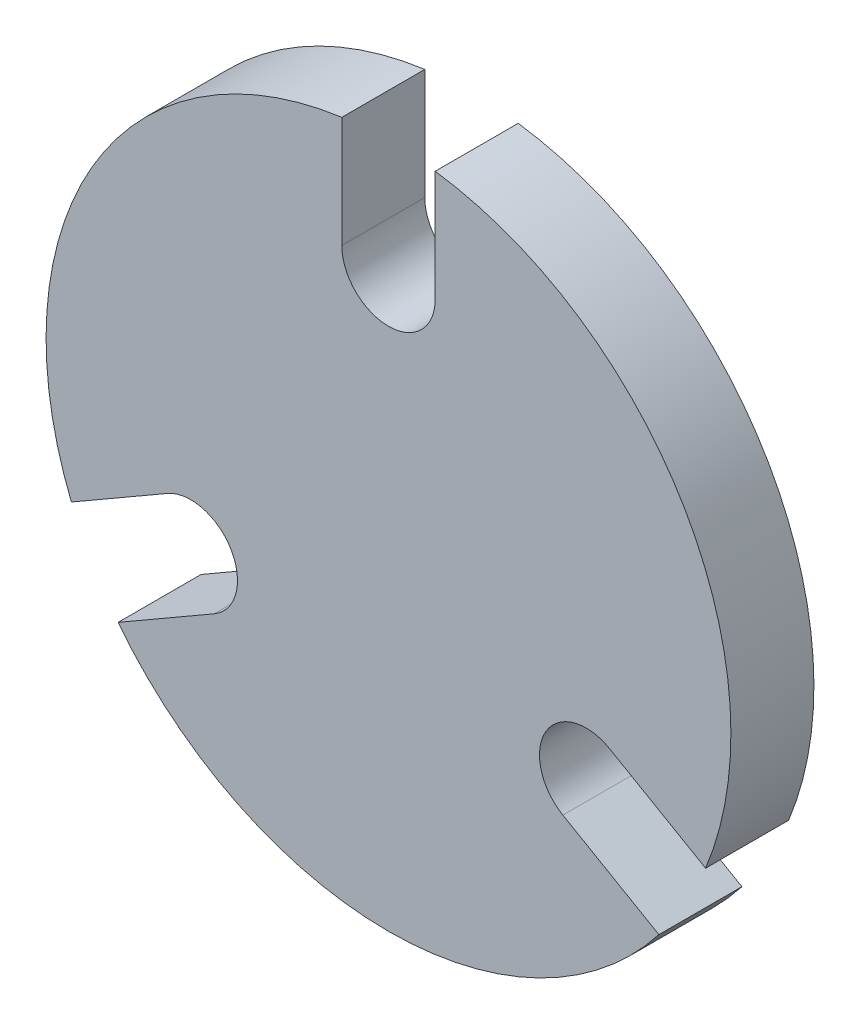
ISO-10303-21;
HEADER;
FILE_DESCRIPTION(('STEP AP214'),'2;1');
FILE_NAME('part.step','',(''),(''),'','','');
FILE_SCHEMA(('AUTOMOTIVE_DESIGN { 1 0 10303 214 1 1 1 1 }'));
ENDSEC;
DATA;
#1=APPLICATION_CONTEXT('core data for automotive mechanical design processes');
#2=APPLICATION_PROTOCOL_DEFINITION('international standard','automotive_design',2000,#1);
#3=PRODUCT_CONTEXT('',#1,'mechanical');
#4=PRODUCT('Part','Part','',(#3));
#5=PRODUCT_RELATED_PRODUCT_CATEGORY('part','',(#4));
#6=PRODUCT_DEFINITION_FORMATION('','',#4);
#7=PRODUCT_DEFINITION_CONTEXT('part definition',#1,'design');
#8=PRODUCT_DEFINITION('design','',#6,#7);
#9=PRODUCT_DEFINITION_SHAPE('','',#8);
#10=(LENGTH_UNIT() NAMED_UNIT(*) SI_UNIT(.MILLI.,.METRE.));
#11=(NAMED_UNIT(*) PLANE_ANGLE_UNIT() SI_UNIT($,.RADIAN.));
#12=(NAMED_UNIT(*) SI_UNIT($,.STERADIAN.) SOLID_ANGLE_UNIT());
#13=UNCERTAINTY_MEASURE_WITH_UNIT(LENGTH_MEASURE(1.E-05),#10,'distance_accuracy_value','');
#14=(GEOMETRIC_REPRESENTATION_CONTEXT(3) GLOBAL_UNCERTAINTY_ASSIGNED_CONTEXT((#13)) GLOBAL_UNIT_ASSIGNED_CONTEXT((#10,
#11,#12)) REPRESENTATION_CONTEXT('',''));
#15=CARTESIAN_POINT('',(0.,0.,0.));
#16=DIRECTION('',(0.,0.,1.));
#17=DIRECTION('',(1.,0.,0.));
#18=AXIS2_PLACEMENT_3D('',#15,#16,#17);
#19=CARTESIAN_POINT('',(0.,2.2,0.8));
#20=DIRECTION('',(0.,0.,-1.));
#21=DIRECTION('',(-1.,0.,0.));
#22=AXIS2_PLACEMENT_3D('',#19,#20,#21);
#23=CYLINDRICAL_SURFACE('',#22,0.45);
#24=CARTESIAN_POINT('',(0.,2.2,0.));
#25=DIRECTION('',(0.,0.,-1.));
#26=DIRECTION('',(1.,0.,0.));
#27=AXIS2_PLACEMENT_3D('',#24,#25,#26);
#28=CIRCLE('',#27,0.45);
#29=CARTESIAN_POINT('',(0.45,2.2,0.));
#30=VERTEX_POINT('',#29);
#31=CARTESIAN_POINT('',(-0.45,2.2,0.));
#32=VERTEX_POINT('',#31);
#33=EDGE_CURVE('E164',#30,#32,#28,.T.);
#34=ORIENTED_EDGE('',*,*,#33,.T.);
#35=DIRECTION('',(0.,0.,-1.));
#36=VECTOR('',#35,1.);
#37=CARTESIAN_POINT('',(-0.45,2.2,0.8));
#38=LINE('',#37,#36);
#39=CARTESIAN_POINT('',(-0.45,2.2,0.8));
#40=VERTEX_POINT('',#39);
#41=EDGE_CURVE('E11',#40,#32,#38,.T.);
#42=ORIENTED_EDGE('',*,*,#41,.F.);
#43=CARTESIAN_POINT('',(0.,2.2,0.8));
#44=DIRECTION('',(0.,0.,-1.));
#45=DIRECTION('',(1.,0.,0.));
#46=AXIS2_PLACEMENT_3D('',#43,#44,#45);
#47=CIRCLE('',#46,0.45);
#48=CARTESIAN_POINT('',(0.45,2.2,0.8));
#49=VERTEX_POINT('',#48);
#50=EDGE_CURVE('E198',#49,#40,#47,.T.);
#51=ORIENTED_EDGE('',*,*,#50,.F.);
#52=DIRECTION('',(0.,0.,-1.));
#53=VECTOR('',#52,1.);
#54=CARTESIAN_POINT('',(0.45,2.2,0.8));
#55=LINE('',#54,#53);
#56=EDGE_CURVE('E160',#49,#30,#55,.T.);
#57=ORIENTED_EDGE('',*,*,#56,.T.);
#58=EDGE_LOOP('',(#34,#42,#51,#57));
#59=FACE_BOUND('',#58,.T.);
#60=ADVANCED_FACE('F39',(#59),#23,.F.);
#61=CARTESIAN_POINT('',(-0.45,2.2,0.8));
#62=DIRECTION('',(-1.,0.,0.));
#63=DIRECTION('',(0.,0.,1.));
#64=AXIS2_PLACEMENT_3D('',#61,#62,#63);
#65=PLANE('',#64);
#66=DIRECTION('',(0.,1.,0.));
#67=VECTOR('',#66,1.);
#68=CARTESIAN_POINT('',(-0.45,2.2,0.));
#69=LINE('',#68,#67);
#70=CARTESIAN_POINT('',(-0.45,3.26917420765551,0.));
#71=VERTEX_POINT('',#70);
#72=EDGE_CURVE('E168',#32,#71,#69,.T.);
#73=ORIENTED_EDGE('',*,*,#72,.T.);
#74=DIRECTION('',(0.,0.,-1.));
#75=VECTOR('',#74,1.);
#76=CARTESIAN_POINT('',(-0.45,3.26917420765551,0.8));
#77=LINE('',#76,#75);
#78=CARTESIAN_POINT('',(-0.45,3.26917420765551,0.8));
#79=VERTEX_POINT('',#78);
#80=EDGE_CURVE('E48',#79,#71,#77,.T.);
#81=ORIENTED_EDGE('',*,*,#80,.F.);
#82=DIRECTION('',(0.,1.,0.));
#83=VECTOR('',#82,1.);
#84=CARTESIAN_POINT('',(-0.45,2.2,0.8));
#85=LINE('',#84,#83);
#86=EDGE_CURVE('E111',#40,#79,#85,.T.);
#87=ORIENTED_EDGE('',*,*,#86,.F.);
#88=ORIENTED_EDGE('',*,*,#41,.T.);
#89=EDGE_LOOP('',(#73,#81,#87,#88));
#90=FACE_BOUND('',#89,.T.);
#91=ADVANCED_FACE('F292',(#90),#65,.F.);
#92=CARTESIAN_POINT('',(0.,0.,0.8));
#93=DIRECTION('',(0.,0.,-1.));
#94=DIRECTION('',(-1.,0.,0.));
#95=AXIS2_PLACEMENT_3D('',#92,#93,#94);
#96=CYLINDRICAL_SURFACE('',#95,3.3);
#97=CARTESIAN_POINT('',(0.,0.,0.));
#98=DIRECTION('',(0.,0.,1.));
#99=DIRECTION('',(1.,0.,0.));
#100=AXIS2_PLACEMENT_3D('',#97,#98,#99);
#101=CIRCLE('',#100,3.3);
#102=CARTESIAN_POINT('',(-3.05618791322653,-1.24487567212476,0.));
#103=VERTEX_POINT('',#102);
#104=EDGE_CURVE('E171',#71,#103,#101,.T.);
#105=ORIENTED_EDGE('',*,*,#104,.T.);
#106=DIRECTION('',(0.,0.,-1.));
#107=VECTOR('',#106,1.);
#108=CARTESIAN_POINT('',(-3.05618791322653,-1.24487567212476,0.8));
#109=LINE('',#108,#107);
#110=CARTESIAN_POINT('',(-3.05618791322653,-1.24487567212476,0.8));
#111=VERTEX_POINT('',#110);
#112=EDGE_CURVE('E225',#111,#103,#109,.T.);
#113=ORIENTED_EDGE('',*,*,#112,.F.);
#114=CARTESIAN_POINT('',(0.,0.,0.8));
#115=DIRECTION('',(0.,0.,1.));
#116=DIRECTION('',(1.,0.,0.));
#117=AXIS2_PLACEMENT_3D('',#114,#115,#116);
#118=CIRCLE('',#117,3.3);
#119=EDGE_CURVE('E235',#79,#111,#118,.T.);
#120=ORIENTED_EDGE('',*,*,#119,.F.);
#121=ORIENTED_EDGE('',*,*,#80,.T.);
#122=EDGE_LOOP('',(#105,#113,#120,#121));
#123=FACE_BOUND('',#122,.T.);
#124=ADVANCED_FACE('F233',(#123),#96,.T.);
#125=CARTESIAN_POINT('',(-2.13025588832576,-0.710288568297004,0.8));
#126=DIRECTION('',(-0.5,0.866025403784438,0.));
#127=DIRECTION('',(-0.866025403784439,-0.5,0.));
#128=AXIS2_PLACEMENT_3D('',#125,#126,#127);
#129=PLANE('',#128);
#130=DIRECTION('',(0.866025403784438,0.5,0.));
#131=VECTOR('',#130,1.);
#132=CARTESIAN_POINT('',(-2.13025588832576,-0.710288568297004,0.));
#133=LINE('',#132,#131);
#134=CARTESIAN_POINT('',(-2.13025588832576,-0.710288568297004,0.));
#135=VERTEX_POINT('',#134);
#136=EDGE_CURVE('E174',#103,#135,#133,.T.);
#137=ORIENTED_EDGE('',*,*,#136,.T.);
#138=DIRECTION('',(0.,0.,-1.));
#139=VECTOR('',#138,1.);
#140=CARTESIAN_POINT('',(-2.13025588832576,-0.710288568297004,0.8));
#141=LINE('',#140,#139);
#142=CARTESIAN_POINT('',(-2.13025588832576,-0.710288568297004,0.8));
#143=VERTEX_POINT('',#142);
#144=EDGE_CURVE('E221',#143,#135,#141,.T.);
#145=ORIENTED_EDGE('',*,*,#144,.F.);
#146=DIRECTION('',(0.866025403784438,0.5,0.));
#147=VECTOR('',#146,1.);
#148=CARTESIAN_POINT('',(-2.13025588832576,-0.710288568297004,0.8));
#149=LINE('',#148,#147);
#150=EDGE_CURVE('E254',#111,#143,#149,.T.);
#151=ORIENTED_EDGE('',*,*,#150,.F.);
#152=ORIENTED_EDGE('',*,*,#112,.T.);
#153=EDGE_LOOP('',(#137,#145,#151,#152));
#154=FACE_BOUND('',#153,.T.);
#155=ADVANCED_FACE('F244',(#154),#129,.F.);
#156=CARTESIAN_POINT('',(-1.90525588832576,-1.1,0.8));
#157=DIRECTION('',(0.,0.,-1.));
#158=DIRECTION('',(-1.,0.,0.));
#159=AXIS2_PLACEMENT_3D('',#156,#157,#158);
#160=CYLINDRICAL_SURFACE('',#159,0.45);
#161=CARTESIAN_POINT('',(-1.90525588832576,-1.1,0.));
#162=DIRECTION('',(0.,0.,-1.));
#163=DIRECTION('',(1.,0.,0.));
#164=AXIS2_PLACEMENT_3D('',#161,#162,#163);
#165=CIRCLE('',#164,0.45);
#166=CARTESIAN_POINT('',(-1.68025588832576,-1.489711431703,0.));
#167=VERTEX_POINT('',#166);
#168=EDGE_CURVE('E177',#135,#167,#165,.T.);
#169=ORIENTED_EDGE('',*,*,#168,.T.);
#170=DIRECTION('',(0.,0.,-1.));
#171=VECTOR('',#170,1.);
#172=CARTESIAN_POINT('',(-1.68025588832576,-1.489711431703,0.8));
#173=LINE('',#172,#171);
#174=CARTESIAN_POINT('',(-1.68025588832576,-1.489711431703,0.8));
#175=VERTEX_POINT('',#174);
#176=EDGE_CURVE('E217',#175,#167,#173,.T.);
#177=ORIENTED_EDGE('',*,*,#176,.F.);
#178=CARTESIAN_POINT('',(-1.90525588832576,-1.1,0.8));
#179=DIRECTION('',(0.,0.,-1.));
#180=DIRECTION('',(1.,0.,0.));
#181=AXIS2_PLACEMENT_3D('',#178,#179,#180);
#182=CIRCLE('',#181,0.45);
#183=EDGE_CURVE('E250',#143,#175,#182,.T.);
#184=ORIENTED_EDGE('',*,*,#183,.F.);
#185=ORIENTED_EDGE('',*,*,#144,.T.);
#186=EDGE_LOOP('',(#169,#177,#184,#185));
#187=FACE_BOUND('',#186,.T.);
#188=ADVANCED_FACE('F248',(#187),#160,.F.);
#189=CARTESIAN_POINT('',(-1.68025588832576,-1.489711431703,0.8));
#190=DIRECTION('',(0.500000000000001,-0.866025403784438,0.));
#191=DIRECTION('',(0.866025403784438,0.500000000000001,0.));
#192=AXIS2_PLACEMENT_3D('',#189,#190,#191);
#193=PLANE('',#192);
#194=DIRECTION('',(-0.866025403784438,-0.500000000000001,0.));
#195=VECTOR('',#194,1.);
#196=CARTESIAN_POINT('',(-1.68025588832576,-1.489711431703,0.));
#197=LINE('',#196,#195);
#198=CARTESIAN_POINT('',(-2.60618791322653,-2.02429853553075,0.));
#199=VERTEX_POINT('',#198);
#200=EDGE_CURVE('E180',#167,#199,#197,.T.);
#201=ORIENTED_EDGE('',*,*,#200,.T.);
#202=DIRECTION('',(0.,0.,-1.));
#203=VECTOR('',#202,1.);
#204=CARTESIAN_POINT('',(-2.60618791322653,-2.02429853553075,0.8));
#205=LINE('',#204,#203);
#206=CARTESIAN_POINT('',(-2.60618791322653,-2.02429853553075,0.8));
#207=VERTEX_POINT('',#206);
#208=EDGE_CURVE('E213',#207,#199,#205,.T.);
#209=ORIENTED_EDGE('',*,*,#208,.F.);
#210=DIRECTION('',(-0.866025403784438,-0.500000000000001,0.));
#211=VECTOR('',#210,1.);
#212=CARTESIAN_POINT('',(-1.68025588832576,-1.489711431703,0.8));
#213=LINE('',#212,#211);
#214=EDGE_CURVE('E253',#175,#207,#213,.T.);
#215=ORIENTED_EDGE('',*,*,#214,.F.);
#216=ORIENTED_EDGE('',*,*,#176,.T.);
#217=EDGE_LOOP('',(#201,#209,#215,#216));
#218=FACE_BOUND('',#217,.T.);
#219=ADVANCED_FACE('F305',(#218),#193,.F.);
#220=CARTESIAN_POINT('',(0.,0.,0.8));
#221=DIRECTION('',(0.,0.,-1.));
#222=DIRECTION('',(-1.,0.,0.));
#223=AXIS2_PLACEMENT_3D('',#220,#221,#222);
#224=CYLINDRICAL_SURFACE('',#223,3.3);
#225=CARTESIAN_POINT('',(0.,0.,0.));
#226=DIRECTION('',(0.,0.,1.));
#227=DIRECTION('',(1.,0.,0.));
#228=AXIS2_PLACEMENT_3D('',#225,#226,#227);
#229=CIRCLE('',#228,3.3);
#230=CARTESIAN_POINT('',(2.60618791322653,-2.02429853553075,0.));
#231=VERTEX_POINT('',#230);
#232=EDGE_CURVE('E183',#199,#231,#229,.T.);
#233=ORIENTED_EDGE('',*,*,#232,.T.);
#234=DIRECTION('',(0.,0.,-1.));
#235=VECTOR('',#234,1.);
#236=CARTESIAN_POINT('',(2.60618791322653,-2.02429853553075,0.8));
#237=LINE('',#236,#235);
#238=CARTESIAN_POINT('',(2.60618791322653,-2.02429853553075,0.8));
#239=VERTEX_POINT('',#238);
#240=EDGE_CURVE('E209',#239,#231,#237,.T.);
#241=ORIENTED_EDGE('',*,*,#240,.F.);
#242=CARTESIAN_POINT('',(0.,0.,0.8));
#243=DIRECTION('',(0.,0.,1.));
#244=DIRECTION('',(1.,0.,0.));
#245=AXIS2_PLACEMENT_3D('',#242,#243,#244);
#246=CIRCLE('',#245,3.3);
#247=EDGE_CURVE('E258',#207,#239,#246,.T.);
#248=ORIENTED_EDGE('',*,*,#247,.F.);
#249=ORIENTED_EDGE('',*,*,#208,.T.);
#250=EDGE_LOOP('',(#233,#241,#248,#249));
#251=FACE_BOUND('',#250,.T.);
#252=ADVANCED_FACE('F308',(#251),#224,.T.);
#253=CARTESIAN_POINT('',(1.68025588832577,-1.489711431703,0.8));
#254=DIRECTION('',(-0.5,-0.866025403784439,0.));
#255=DIRECTION('',(0.866025403784439,-0.5,0.));
#256=AXIS2_PLACEMENT_3D('',#253,#254,#255);
#257=PLANE('',#256);
#258=DIRECTION('',(-0.866025403784439,0.5,0.));
#259=VECTOR('',#258,1.);
#260=CARTESIAN_POINT('',(1.68025588832577,-1.489711431703,0.));
#261=LINE('',#260,#259);
#262=CARTESIAN_POINT('',(1.68025588832577,-1.489711431703,0.));
#263=VERTEX_POINT('',#262);
#264=EDGE_CURVE('E186',#231,#263,#261,.T.);
#265=ORIENTED_EDGE('',*,*,#264,.T.);
#266=DIRECTION('',(0.,0.,-1.));
#267=VECTOR('',#266,1.);
#268=CARTESIAN_POINT('',(1.68025588832577,-1.489711431703,0.8));
#269=LINE('',#268,#267);
#270=CARTESIAN_POINT('',(1.68025588832577,-1.489711431703,0.8));
#271=VERTEX_POINT('',#270);
#272=EDGE_CURVE('E205',#271,#263,#269,.T.);
#273=ORIENTED_EDGE('',*,*,#272,.F.);
#274=DIRECTION('',(-0.866025403784439,0.5,0.));
#275=VECTOR('',#274,1.);
#276=CARTESIAN_POINT('',(1.68025588832577,-1.489711431703,0.8));
#277=LINE('',#276,#275);
#278=EDGE_CURVE('E265',#239,#271,#277,.T.);
#279=ORIENTED_EDGE('',*,*,#278,.F.);
#280=ORIENTED_EDGE('',*,*,#240,.T.);
#281=EDGE_LOOP('',(#265,#273,#279,#280));
#282=FACE_BOUND('',#281,.T.);
#283=ADVANCED_FACE('F273',(#282),#257,.F.);
#284=CARTESIAN_POINT('',(1.90525588832577,-1.1,0.8));
#285=DIRECTION('',(0.,0.,-1.));
#286=DIRECTION('',(-1.,0.,0.));
#287=AXIS2_PLACEMENT_3D('',#284,#285,#286);
#288=CYLINDRICAL_SURFACE('',#287,0.45);
#289=CARTESIAN_POINT('',(1.90525588832577,-1.1,0.));
#290=DIRECTION('',(0.,0.,-1.));
#291=DIRECTION('',(1.,0.,0.));
#292=AXIS2_PLACEMENT_3D('',#289,#290,#291);
#293=CIRCLE('',#292,0.45);
#294=CARTESIAN_POINT('',(2.13025588832576,-0.710288568297002,0.));
#295=VERTEX_POINT('',#294);
#296=EDGE_CURVE('E189',#263,#295,#293,.T.);
#297=ORIENTED_EDGE('',*,*,#296,.T.);
#298=DIRECTION('',(0.,0.,-1.));
#299=VECTOR('',#298,1.);
#300=CARTESIAN_POINT('',(2.13025588832576,-0.710288568297002,0.8));
#301=LINE('',#300,#299);
#302=CARTESIAN_POINT('',(2.13025588832576,-0.710288568297002,0.8));
#303=VERTEX_POINT('',#302);
#304=EDGE_CURVE('E153',#303,#295,#301,.T.);
#305=ORIENTED_EDGE('',*,*,#304,.F.);
#306=CARTESIAN_POINT('',(1.90525588832577,-1.1,0.8));
#307=DIRECTION('',(0.,0.,-1.));
#308=DIRECTION('',(1.,0.,0.));
#309=AXIS2_PLACEMENT_3D('',#306,#307,#308);
#310=CIRCLE('',#309,0.45);
#311=EDGE_CURVE('E142',#271,#303,#310,.T.);
#312=ORIENTED_EDGE('',*,*,#311,.F.);
#313=ORIENTED_EDGE('',*,*,#272,.T.);
#314=EDGE_LOOP('',(#297,#305,#312,#313));
#315=FACE_BOUND('',#314,.T.);
#316=ADVANCED_FACE('F277',(#315),#288,.F.);
#317=CARTESIAN_POINT('',(2.13025588832576,-0.710288568297002,0.8));
#318=DIRECTION('',(0.5,0.866025403784439,0.));
#319=DIRECTION('',(-0.866025403784439,0.5,0.));
#320=AXIS2_PLACEMENT_3D('',#317,#318,#319);
#321=PLANE('',#320);
#322=DIRECTION('',(0.866025403784439,-0.5,0.));
#323=VECTOR('',#322,1.);
#324=CARTESIAN_POINT('',(2.13025588832576,-0.710288568297002,0.));
#325=LINE('',#324,#323);
#326=CARTESIAN_POINT('',(3.05618791322653,-1.24487567212475,0.));
#327=VERTEX_POINT('',#326);
#328=EDGE_CURVE('E151',#295,#327,#325,.T.);
#329=ORIENTED_EDGE('',*,*,#328,.T.);
#330=DIRECTION('',(0.,0.,-1.));
#331=VECTOR('',#330,1.);
#332=CARTESIAN_POINT('',(3.05618791322653,-1.24487567212475,0.8));
#333=LINE('',#332,#331);
#334=CARTESIAN_POINT('',(3.05618791322653,-1.24487567212475,0.8));
#335=VERTEX_POINT('',#334);
#336=EDGE_CURVE('E148',#335,#327,#333,.T.);
#337=ORIENTED_EDGE('',*,*,#336,.F.);
#338=DIRECTION('',(0.866025403784439,-0.5,0.));
#339=VECTOR('',#338,1.);
#340=CARTESIAN_POINT('',(2.13025588832576,-0.710288568297002,0.8));
#341=LINE('',#340,#339);
#342=EDGE_CURVE('E136',#303,#335,#341,.T.);
#343=ORIENTED_EDGE('',*,*,#342,.F.);
#344=ORIENTED_EDGE('',*,*,#304,.T.);
#345=EDGE_LOOP('',(#329,#337,#343,#344));
#346=FACE_BOUND('',#345,.T.);
#347=ADVANCED_FACE('F149',(#346),#321,.F.);
#348=CARTESIAN_POINT('',(0.,0.,0.8));
#349=DIRECTION('',(0.,0.,-1.));
#350=DIRECTION('',(-1.,0.,0.));
#351=AXIS2_PLACEMENT_3D('',#348,#349,#350);
#352=CYLINDRICAL_SURFACE('',#351,3.3);
#353=CARTESIAN_POINT('',(0.,0.,0.));
#354=DIRECTION('',(0.,0.,1.));
#355=DIRECTION('',(1.,0.,0.));
#356=AXIS2_PLACEMENT_3D('',#353,#354,#355);
#357=CIRCLE('',#356,3.3);
#358=CARTESIAN_POINT('',(0.45,3.2691742076555,0.));
#359=VERTEX_POINT('',#358);
#360=EDGE_CURVE('E97',#327,#359,#357,.T.);
#361=ORIENTED_EDGE('',*,*,#360,.T.);
#362=DIRECTION('',(0.,0.,-1.));
#363=VECTOR('',#362,1.);
#364=CARTESIAN_POINT('',(0.45,3.2691742076555,0.8));
#365=LINE('',#364,#363);
#366=CARTESIAN_POINT('',(0.45,3.2691742076555,0.8));
#367=VERTEX_POINT('',#366);
#368=EDGE_CURVE('E154',#367,#359,#365,.T.);
#369=ORIENTED_EDGE('',*,*,#368,.F.);
#370=CARTESIAN_POINT('',(0.,0.,0.8));
#371=DIRECTION('',(0.,0.,1.));
#372=DIRECTION('',(1.,0.,0.));
#373=AXIS2_PLACEMENT_3D('',#370,#371,#372);
#374=CIRCLE('',#373,3.3);
#375=EDGE_CURVE('E140',#335,#367,#374,.T.);
#376=ORIENTED_EDGE('',*,*,#375,.F.);
#377=ORIENTED_EDGE('',*,*,#336,.T.);
#378=EDGE_LOOP('',(#361,#369,#376,#377));
#379=FACE_BOUND('',#378,.T.);
#380=ADVANCED_FACE('F156',(#379),#352,.T.);
#381=CARTESIAN_POINT('',(0.45,2.2,0.8));
#382=DIRECTION('',(1.,0.,0.));
#383=DIRECTION('',(0.,0.,-1.));
#384=AXIS2_PLACEMENT_3D('',#381,#382,#383);
#385=PLANE('',#384);
#386=DIRECTION('',(0.,-1.,0.));
#387=VECTOR('',#386,1.);
#388=CARTESIAN_POINT('',(0.45,2.2,0.));
#389=LINE('',#388,#387);
#390=EDGE_CURVE('E103',#359,#30,#389,.T.);
#391=ORIENTED_EDGE('',*,*,#390,.T.);
#392=ORIENTED_EDGE('',*,*,#56,.F.);
#393=DIRECTION('',(0.,-1.,0.));
#394=VECTOR('',#393,1.);
#395=CARTESIAN_POINT('',(0.45,2.2,0.8));
#396=LINE('',#395,#394);
#397=EDGE_CURVE('E56',#367,#49,#396,.T.);
#398=ORIENTED_EDGE('',*,*,#397,.F.);
#399=ORIENTED_EDGE('',*,*,#368,.T.);
#400=EDGE_LOOP('',(#391,#392,#398,#399));
#401=FACE_BOUND('',#400,.T.);
#402=ADVANCED_FACE('F281',(#401),#385,.F.);
#403=CARTESIAN_POINT('',(0.,2.2,0.8));
#404=DIRECTION('',(0.,0.,1.));
#405=DIRECTION('',(1.,0.,0.));
#406=AXIS2_PLACEMENT_3D('',#403,#404,#405);
#407=PLANE('',#406);
#408=ORIENTED_EDGE('',*,*,#50,.T.);
#409=ORIENTED_EDGE('',*,*,#86,.T.);
#410=ORIENTED_EDGE('',*,*,#119,.T.);
#411=ORIENTED_EDGE('',*,*,#150,.T.);
#412=ORIENTED_EDGE('',*,*,#183,.T.);
#413=ORIENTED_EDGE('',*,*,#214,.T.);
#414=ORIENTED_EDGE('',*,*,#247,.T.);
#415=ORIENTED_EDGE('',*,*,#278,.T.);
#416=ORIENTED_EDGE('',*,*,#311,.T.);
#417=ORIENTED_EDGE('',*,*,#342,.T.);
#418=ORIENTED_EDGE('',*,*,#375,.T.);
#419=ORIENTED_EDGE('',*,*,#397,.T.);
#420=EDGE_LOOP('',(#408,#409,#410,#411,#412,#413,#414,#415,#416,#417,#418,#419));
#421=FACE_BOUND('',#420,.T.);
#422=ADVANCED_FACE('F138',(#421),#407,.T.);
#423=CARTESIAN_POINT('',(0.,2.2,0.));
#424=DIRECTION('',(0.,0.,1.));
#425=DIRECTION('',(1.,0.,0.));
#426=AXIS2_PLACEMENT_3D('',#423,#424,#425);
#427=PLANE('',#426);
#428=ORIENTED_EDGE('',*,*,#33,.F.);
#429=ORIENTED_EDGE('',*,*,#390,.F.);
#430=ORIENTED_EDGE('',*,*,#360,.F.);
#431=ORIENTED_EDGE('',*,*,#328,.F.);
#432=ORIENTED_EDGE('',*,*,#296,.F.);
#433=ORIENTED_EDGE('',*,*,#264,.F.);
#434=ORIENTED_EDGE('',*,*,#232,.F.);
#435=ORIENTED_EDGE('',*,*,#200,.F.);
#436=ORIENTED_EDGE('',*,*,#168,.F.);
#437=ORIENTED_EDGE('',*,*,#136,.F.);
#438=ORIENTED_EDGE('',*,*,#104,.F.);
#439=ORIENTED_EDGE('',*,*,#72,.F.);
#440=EDGE_LOOP('',(#428,#429,#430,#431,#432,#433,#434,#435,#436,#437,#438,#439));
#441=FACE_BOUND('',#440,.T.);
#442=ADVANCED_FACE('F239',(#441),#427,.F.);
#443=CLOSED_SHELL('',(#60,#91,#124,#155,#188,#219,#252,#283,#316,#347,#380,#402,#422,#442));
#444=MANIFOLD_SOLID_BREP('B2',#443);
#445=ADVANCED_BREP_SHAPE_REPRESENTATION('',(#18,#444),#14);
#446=SHAPE_DEFINITION_REPRESENTATION(#9,#445);
ENDSEC;
END-ISO-10303-21;
